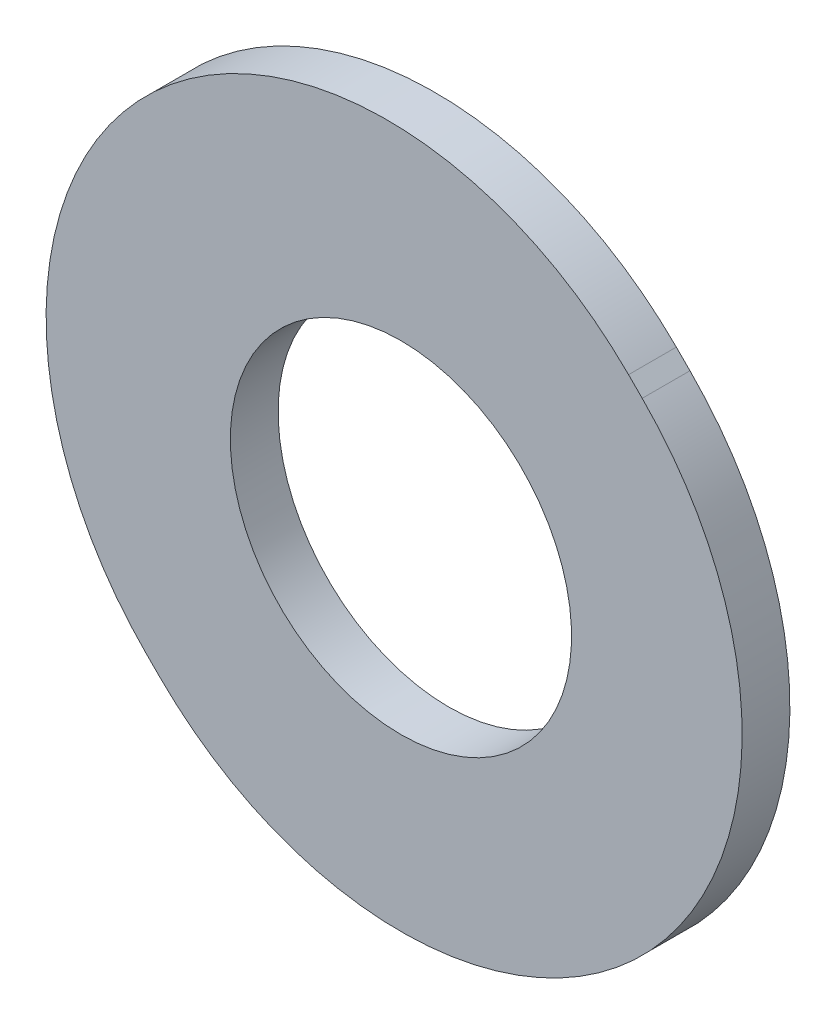
ISO-10303-21;
HEADER;
FILE_DESCRIPTION(('STEP AP214'),'2;1');
FILE_NAME('part.step','',(''),(''),'','','');
FILE_SCHEMA(('AUTOMOTIVE_DESIGN { 1 0 10303 214 1 1 1 1 }'));
ENDSEC;
DATA;
#1=APPLICATION_CONTEXT('core data for automotive mechanical design processes');
#2=APPLICATION_PROTOCOL_DEFINITION('international standard','automotive_design',2000,#1);
#3=PRODUCT_CONTEXT('',#1,'mechanical');
#4=PRODUCT('Part','Part','',(#3));
#5=PRODUCT_RELATED_PRODUCT_CATEGORY('part','',(#4));
#6=PRODUCT_DEFINITION_FORMATION('','',#4);
#7=PRODUCT_DEFINITION_CONTEXT('part definition',#1,'design');
#8=PRODUCT_DEFINITION('design','',#6,#7);
#9=PRODUCT_DEFINITION_SHAPE('','',#8);
#10=(LENGTH_UNIT() NAMED_UNIT(*) SI_UNIT(.MILLI.,.METRE.));
#11=(NAMED_UNIT(*) PLANE_ANGLE_UNIT() SI_UNIT($,.RADIAN.));
#12=(NAMED_UNIT(*) SI_UNIT($,.STERADIAN.) SOLID_ANGLE_UNIT());
#13=UNCERTAINTY_MEASURE_WITH_UNIT(LENGTH_MEASURE(1.E-05),#10,'distance_accuracy_value','');
#14=(GEOMETRIC_REPRESENTATION_CONTEXT(3) GLOBAL_UNCERTAINTY_ASSIGNED_CONTEXT((#13)) GLOBAL_UNIT_ASSIGNED_CONTEXT((#10,
#11,#12)) REPRESENTATION_CONTEXT('',''));
#15=CARTESIAN_POINT('',(0.,0.,0.));
#16=DIRECTION('',(0.,0.,1.));
#17=DIRECTION('',(1.,0.,0.));
#18=AXIS2_PLACEMENT_3D('',#15,#16,#17);
#19=CARTESIAN_POINT('',(102.31,-72.01,-0.045));
#20=DIRECTION('',(0.,0.,-1.));
#21=DIRECTION('',(0.,-1.,0.));
#22=AXIS2_PLACEMENT_3D('',#19,#20,#21);
#23=CYLINDRICAL_SURFACE('',#22,0.125);
#24=CARTESIAN_POINT('',(102.31,-72.01,-0.035));
#25=DIRECTION('',(0.,0.,-1.));
#26=DIRECTION('',(0.,-1.,0.));
#27=AXIS2_PLACEMENT_3D('',#24,#25,#26);
#28=CIRCLE('',#27,0.125);
#29=CARTESIAN_POINT('',(102.31,-72.135,-0.035));
#30=VERTEX_POINT('',#29);
#31=EDGE_CURVE('E124',#30,#30,#28,.T.);
#32=ORIENTED_EDGE('',*,*,#31,.T.);
#33=DIRECTION('',(0.,0.,1.));
#34=VECTOR('',#33,1.);
#35=CARTESIAN_POINT('',(102.31,-72.135,-0.045));
#36=LINE('',#35,#34);
#37=CARTESIAN_POINT('',(102.31,-72.135,0.));
#38=VERTEX_POINT('',#37);
#39=EDGE_CURVE('E11',#30,#38,#36,.T.);
#40=ORIENTED_EDGE('',*,*,#39,.T.);
#41=CARTESIAN_POINT('',(102.31,-72.01,0.));
#42=DIRECTION('',(0.,0.,-1.));
#43=DIRECTION('',(0.,-1.,0.));
#44=AXIS2_PLACEMENT_3D('',#41,#42,#43);
#45=CIRCLE('',#44,0.125);
#46=EDGE_CURVE('E26',#38,#38,#45,.T.);
#47=ORIENTED_EDGE('',*,*,#46,.F.);
#48=ORIENTED_EDGE('',*,*,#39,.F.);
#49=EDGE_LOOP('',(#32,#40,#47,#48));
#50=FACE_BOUND('',#49,.T.);
#51=ADVANCED_FACE('F17',(#50),#23,.F.);
#52=CARTESIAN_POINT('',(102.486776,-71.833223,-0.035));
#53=DIRECTION('',(-0.707106781186548,-0.707106781186548,0.));
#54=DIRECTION('',(-0.707106781186548,0.707106781186548,0.));
#55=AXIS2_PLACEMENT_3D('',#52,#53,#54);
#56=PLANE('',#55);
#57=DIRECTION('',(-0.707106781186548,0.707106781186548,0.));
#58=VECTOR('',#57,1.);
#59=CARTESIAN_POINT('',(102.486776,-71.833223,-0.035));
#60=LINE('',#59,#58);
#61=CARTESIAN_POINT('',(102.486776,-71.833223,-0.035));
#62=VERTEX_POINT('',#61);
#63=CARTESIAN_POINT('',(102.476776,-71.823223,-0.035));
#64=VERTEX_POINT('',#63);
#65=EDGE_CURVE('E121',#62,#64,#60,.T.);
#66=ORIENTED_EDGE('',*,*,#65,.T.);
#67=DIRECTION('',(0.,0.,1.));
#68=VECTOR('',#67,1.);
#69=CARTESIAN_POINT('',(102.476776,-71.823223,-0.035));
#70=LINE('',#69,#68);
#71=CARTESIAN_POINT('',(102.476776,-71.823223,0.));
#72=VERTEX_POINT('',#71);
#73=EDGE_CURVE('E85',#64,#72,#70,.T.);
#74=ORIENTED_EDGE('',*,*,#73,.T.);
#75=DIRECTION('',(-0.707106781186548,0.707106781186548,0.));
#76=VECTOR('',#75,1.);
#77=CARTESIAN_POINT('',(102.486776,-71.833223,0.));
#78=LINE('',#77,#76);
#79=CARTESIAN_POINT('',(102.486776,-71.833223,0.));
#80=VERTEX_POINT('',#79);
#81=EDGE_CURVE('E20',#80,#72,#78,.T.);
#82=ORIENTED_EDGE('',*,*,#81,.F.);
#83=DIRECTION('',(0.,0.,1.));
#84=VECTOR('',#83,1.);
#85=CARTESIAN_POINT('',(102.486776,-71.833223,-0.035));
#86=LINE('',#85,#84);
#87=EDGE_CURVE('E127',#62,#80,#86,.T.);
#88=ORIENTED_EDGE('',*,*,#87,.F.);
#89=EDGE_LOOP('',(#66,#74,#82,#88));
#90=FACE_BOUND('',#89,.T.);
#91=ADVANCED_FACE('F145',(#90),#56,.F.);
#92=CARTESIAN_POINT('',(102.123223,-72.176776,0.));
#93=DIRECTION('',(0.,0.,1.));
#94=DIRECTION('',(1.,0.,0.));
#95=AXIS2_PLACEMENT_3D('',#92,#93,#94);
#96=PLANE('',#95);
#97=ORIENTED_EDGE('',*,*,#46,.T.);
#98=EDGE_LOOP('',(#97));
#99=FACE_BOUND('',#98,.T.);
#100=DIRECTION('',(0.707106781187048,-0.707106781186048,0.));
#101=VECTOR('',#100,1.);
#102=CARTESIAN_POINT('',(102.123223,-72.176776,0.));
#103=LINE('',#102,#101);
#104=CARTESIAN_POINT('',(102.123223,-72.176776,0.));
#105=VERTEX_POINT('',#104);
#106=CARTESIAN_POINT('',(102.133223,-72.186776,0.));
#107=VERTEX_POINT('',#106);
#108=EDGE_CURVE('E97',#105,#107,#103,.T.);
#109=ORIENTED_EDGE('',*,*,#108,.T.);
#110=CARTESIAN_POINT('',(102.3099995,-72.0099995,0.));
#111=DIRECTION('',(0.,0.,1.));
#112=DIRECTION('',(-0.707106781186548,-0.707106781186548,0.));
#113=AXIS2_PLACEMENT_3D('',#110,#111,#112);
#114=CIRCLE('',#113,0.249999723809);
#115=EDGE_CURVE('E125',#107,#80,#114,.T.);
#116=ORIENTED_EDGE('',*,*,#115,.T.);
#117=ORIENTED_EDGE('',*,*,#81,.T.);
#118=CARTESIAN_POINT('',(102.2999995,-71.9999995,0.));
#119=DIRECTION('',(0.,0.,1.));
#120=DIRECTION('',(0.707106781186548,0.707106781186548,0.));
#121=AXIS2_PLACEMENT_3D('',#118,#119,#120);
#122=CIRCLE('',#121,0.249999723809);
#123=EDGE_CURVE('E89',#72,#105,#122,.T.);
#124=ORIENTED_EDGE('',*,*,#123,.T.);
#125=EDGE_LOOP('',(#109,#116,#117,#124));
#126=FACE_BOUND('',#125,.T.);
#127=ADVANCED_FACE('F142',(#99,#126),#96,.T.);
#128=CARTESIAN_POINT('',(102.123223,-72.176776,-0.035));
#129=DIRECTION('',(0.,0.,1.));
#130=DIRECTION('',(1.,0.,0.));
#131=AXIS2_PLACEMENT_3D('',#128,#129,#130);
#132=PLANE('',#131);
#133=ORIENTED_EDGE('',*,*,#31,.F.);
#134=EDGE_LOOP('',(#133));
#135=FACE_BOUND('',#134,.T.);
#136=CARTESIAN_POINT('',(102.2999995,-71.9999995,-0.035));
#137=DIRECTION('',(0.,0.,1.));
#138=DIRECTION('',(0.707106781186548,0.707106781186548,0.));
#139=AXIS2_PLACEMENT_3D('',#136,#137,#138);
#140=CIRCLE('',#139,0.249999723809);
#141=CARTESIAN_POINT('',(102.123223,-72.176776,-0.035));
#142=VERTEX_POINT('',#141);
#143=EDGE_CURVE('E78',#64,#142,#140,.T.);
#144=ORIENTED_EDGE('',*,*,#143,.F.);
#145=ORIENTED_EDGE('',*,*,#65,.F.);
#146=CARTESIAN_POINT('',(102.3099995,-72.0099995,-0.035));
#147=DIRECTION('',(0.,0.,1.));
#148=DIRECTION('',(-0.707106781186548,-0.707106781186548,0.));
#149=AXIS2_PLACEMENT_3D('',#146,#147,#148);
#150=CIRCLE('',#149,0.249999723809);
#151=CARTESIAN_POINT('',(102.133223,-72.186776,-0.035));
#152=VERTEX_POINT('',#151);
#153=EDGE_CURVE('E102',#152,#62,#150,.T.);
#154=ORIENTED_EDGE('',*,*,#153,.F.);
#155=DIRECTION('',(0.707106781187048,-0.707106781186048,0.));
#156=VECTOR('',#155,1.);
#157=CARTESIAN_POINT('',(102.123223,-72.176776,-0.035));
#158=LINE('',#157,#156);
#159=EDGE_CURVE('E95',#142,#152,#158,.T.);
#160=ORIENTED_EDGE('',*,*,#159,.F.);
#161=EDGE_LOOP('',(#144,#145,#154,#160));
#162=FACE_BOUND('',#161,.T.);
#163=ADVANCED_FACE('F100',(#135,#162),#132,.F.);
#164=CARTESIAN_POINT('',(102.3099995,-72.0099995,-0.035));
#165=DIRECTION('',(0.,0.,-1.));
#166=DIRECTION('',(-0.707106781186548,-0.707106781186548,0.));
#167=AXIS2_PLACEMENT_3D('',#164,#165,#166);
#168=CYLINDRICAL_SURFACE('',#167,0.249999723809);
#169=ORIENTED_EDGE('',*,*,#153,.T.);
#170=ORIENTED_EDGE('',*,*,#87,.T.);
#171=ORIENTED_EDGE('',*,*,#115,.F.);
#172=DIRECTION('',(0.,0.,1.));
#173=VECTOR('',#172,1.);
#174=CARTESIAN_POINT('',(102.133223,-72.186776,-0.035));
#175=LINE('',#174,#173);
#176=EDGE_CURVE('E105',#152,#107,#175,.T.);
#177=ORIENTED_EDGE('',*,*,#176,.F.);
#178=EDGE_LOOP('',(#169,#170,#171,#177));
#179=FACE_BOUND('',#178,.T.);
#180=ADVANCED_FACE('F147',(#179),#168,.T.);
#181=CARTESIAN_POINT('',(102.2999995,-71.9999995,-0.035));
#182=DIRECTION('',(0.,0.,-1.));
#183=DIRECTION('',(0.707106781186548,0.707106781186548,0.));
#184=AXIS2_PLACEMENT_3D('',#181,#182,#183);
#185=CYLINDRICAL_SURFACE('',#184,0.249999723809);
#186=ORIENTED_EDGE('',*,*,#143,.T.);
#187=DIRECTION('',(0.,0.,1.));
#188=VECTOR('',#187,1.);
#189=CARTESIAN_POINT('',(102.123223,-72.176776,-0.035));
#190=LINE('',#189,#188);
#191=EDGE_CURVE('E82',#142,#105,#190,.T.);
#192=ORIENTED_EDGE('',*,*,#191,.T.);
#193=ORIENTED_EDGE('',*,*,#123,.F.);
#194=ORIENTED_EDGE('',*,*,#73,.F.);
#195=EDGE_LOOP('',(#186,#192,#193,#194));
#196=FACE_BOUND('',#195,.T.);
#197=ADVANCED_FACE('F80',(#196),#185,.T.);
#198=CARTESIAN_POINT('',(102.123223,-72.176776,-0.035));
#199=DIRECTION('',(0.707106781186048,0.707106781187048,0.));
#200=DIRECTION('',(0.,0.,-1.));
#201=AXIS2_PLACEMENT_3D('',#198,#199,#200);
#202=PLANE('',#201);
#203=ORIENTED_EDGE('',*,*,#159,.T.);
#204=ORIENTED_EDGE('',*,*,#176,.T.);
#205=ORIENTED_EDGE('',*,*,#108,.F.);
#206=ORIENTED_EDGE('',*,*,#191,.F.);
#207=EDGE_LOOP('',(#203,#204,#205,#206));
#208=FACE_BOUND('',#207,.T.);
#209=ADVANCED_FACE('F93',(#208),#202,.F.);
#210=CLOSED_SHELL('',(#51,#91,#127,#163,#180,#197,#209));
#211=MANIFOLD_SOLID_BREP('B1',#210);
#212=ADVANCED_BREP_SHAPE_REPRESENTATION('',(#18,#211),#14);
#213=SHAPE_DEFINITION_REPRESENTATION(#9,#212);
ENDSEC;
END-ISO-10303-21;
